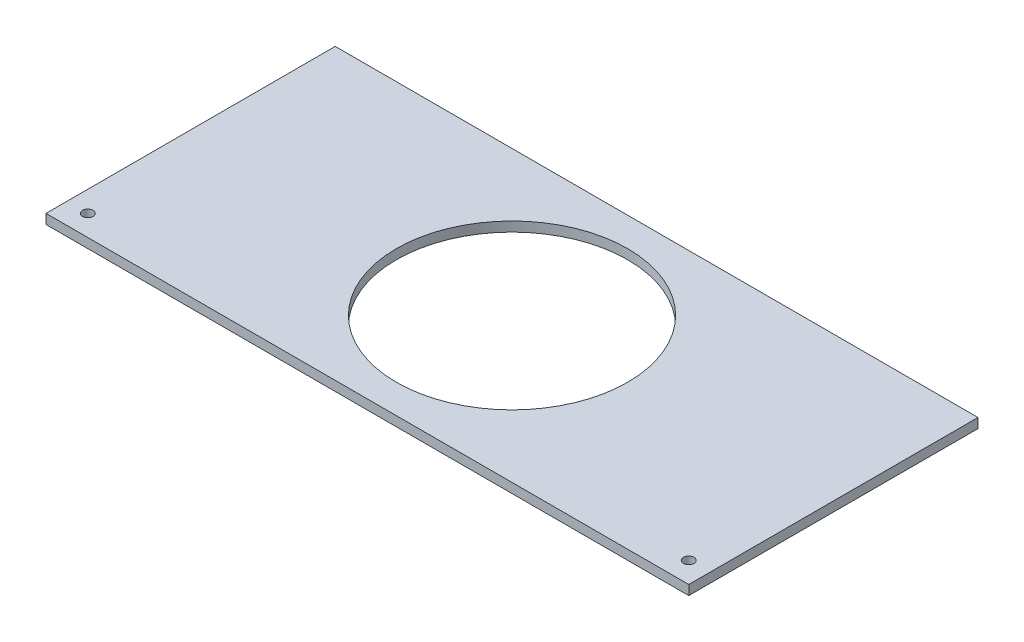
ISO-10303-21;
HEADER;
FILE_DESCRIPTION(('STEP AP214'),'2;1');
FILE_NAME('part.step','',(''),(''),'','','');
FILE_SCHEMA(('AUTOMOTIVE_DESIGN { 1 0 10303 214 1 1 1 1 }'));
ENDSEC;
DATA;
#1=APPLICATION_CONTEXT('core data for automotive mechanical design processes');
#2=APPLICATION_PROTOCOL_DEFINITION('international standard','automotive_design',2000,#1);
#3=PRODUCT_CONTEXT('',#1,'mechanical');
#4=PRODUCT('Part','Part','',(#3));
#5=PRODUCT_RELATED_PRODUCT_CATEGORY('part','',(#4));
#6=PRODUCT_DEFINITION_FORMATION('','',#4);
#7=PRODUCT_DEFINITION_CONTEXT('part definition',#1,'design');
#8=PRODUCT_DEFINITION('design','',#6,#7);
#9=PRODUCT_DEFINITION_SHAPE('','',#8);
#10=(LENGTH_UNIT() NAMED_UNIT(*) SI_UNIT(.MILLI.,.METRE.));
#11=(NAMED_UNIT(*) PLANE_ANGLE_UNIT() SI_UNIT($,.RADIAN.));
#12=(NAMED_UNIT(*) SI_UNIT($,.STERADIAN.) SOLID_ANGLE_UNIT());
#13=UNCERTAINTY_MEASURE_WITH_UNIT(LENGTH_MEASURE(1.E-05),#10,'distance_accuracy_value','');
#14=(GEOMETRIC_REPRESENTATION_CONTEXT(3) GLOBAL_UNCERTAINTY_ASSIGNED_CONTEXT((#13)) GLOBAL_UNIT_ASSIGNED_CONTEXT((#10,
#11,#12)) REPRESENTATION_CONTEXT('',''));
#15=CARTESIAN_POINT('',(0.,0.,0.));
#16=DIRECTION('',(0.,0.,1.));
#17=DIRECTION('',(1.,0.,0.));
#18=AXIS2_PLACEMENT_3D('',#15,#16,#17);
#19=CARTESIAN_POINT('',(0.,3.,0.));
#20=DIRECTION('',(0.,-1.,0.));
#21=DIRECTION('',(0.,0.,-1.));
#22=AXIS2_PLACEMENT_3D('',#19,#20,#21);
#23=PLANE('',#22);
#24=CARTESIAN_POINT('',(6.50000000000006,3.,-6.49999999999995));
#25=DIRECTION('',(0.,1.,0.));
#26=DIRECTION('',(0.,0.,1.));
#27=AXIS2_PLACEMENT_3D('',#24,#25,#26);
#28=CIRCLE('',#27,1.65);
#29=CARTESIAN_POINT('',(6.50000000000006,3.,-4.84999999999995));
#30=VERTEX_POINT('',#29);
#31=EDGE_CURVE('E114',#30,#30,#28,.T.);
#32=ORIENTED_EDGE('',*,*,#31,.F.);
#33=EDGE_LOOP('',(#32));
#34=FACE_BOUND('',#33,.T.);
#35=DIRECTION('',(0.,0.,1.));
#36=VECTOR('',#35,1.);
#37=CARTESIAN_POINT('',(0.,3.,0.));
#38=LINE('',#37,#36);
#39=CARTESIAN_POINT('',(0.,3.,-90.));
#40=VERTEX_POINT('',#39);
#41=CARTESIAN_POINT('',(0.,3.,0.));
#42=VERTEX_POINT('',#41);
#43=EDGE_CURVE('E84',#40,#42,#38,.T.);
#44=ORIENTED_EDGE('',*,*,#43,.T.);
#45=DIRECTION('',(1.,0.,0.));
#46=VECTOR('',#45,1.);
#47=CARTESIAN_POINT('',(0.,3.,0.));
#48=LINE('',#47,#46);
#49=CARTESIAN_POINT('',(200.,3.,0.));
#50=VERTEX_POINT('',#49);
#51=EDGE_CURVE('E79',#42,#50,#48,.T.);
#52=ORIENTED_EDGE('',*,*,#51,.T.);
#53=DIRECTION('',(0.,0.,-1.));
#54=VECTOR('',#53,1.);
#55=CARTESIAN_POINT('',(200.,3.,0.));
#56=LINE('',#55,#54);
#57=CARTESIAN_POINT('',(200.,3.,-90.));
#58=VERTEX_POINT('',#57);
#59=EDGE_CURVE('E82',#50,#58,#56,.T.);
#60=ORIENTED_EDGE('',*,*,#59,.T.);
#61=DIRECTION('',(-1.,0.,0.));
#62=VECTOR('',#61,1.);
#63=CARTESIAN_POINT('',(0.,3.,-90.));
#64=LINE('',#63,#62);
#65=EDGE_CURVE('E49',#58,#40,#64,.T.);
#66=ORIENTED_EDGE('',*,*,#65,.T.);
#67=EDGE_LOOP('',(#44,#52,#60,#66));
#68=FACE_BOUND('',#67,.T.);
#69=CARTESIAN_POINT('',(100.,3.,-45.));
#70=DIRECTION('',(0.,1.,0.));
#71=DIRECTION('',(0.,0.,1.));
#72=AXIS2_PLACEMENT_3D('',#69,#70,#71);
#73=CIRCLE('',#72,36.);
#74=CARTESIAN_POINT('',(100.,3.,-8.99999999999997));
#75=VERTEX_POINT('',#74);
#76=EDGE_CURVE('E99',#75,#75,#73,.T.);
#77=ORIENTED_EDGE('',*,*,#76,.F.);
#78=EDGE_LOOP('',(#77));
#79=FACE_BOUND('',#78,.T.);
#80=CARTESIAN_POINT('',(193.5,3.,-6.49999999999998));
#81=DIRECTION('',(0.,1.,0.));
#82=DIRECTION('',(0.,0.,1.));
#83=AXIS2_PLACEMENT_3D('',#80,#81,#82);
#84=CIRCLE('',#83,1.65000000000002);
#85=CARTESIAN_POINT('',(193.5,3.,-4.84999999999996));
#86=VERTEX_POINT('',#85);
#87=EDGE_CURVE('E120',#86,#86,#84,.T.);
#88=ORIENTED_EDGE('',*,*,#87,.F.);
#89=EDGE_LOOP('',(#88));
#90=FACE_BOUND('',#89,.T.);
#91=ADVANCED_FACE('F32',(#34,#68,#79,#90),#23,.F.);
#92=CARTESIAN_POINT('',(0.,0.,0.));
#93=DIRECTION('',(0.,-1.,0.));
#94=DIRECTION('',(0.,0.,-1.));
#95=AXIS2_PLACEMENT_3D('',#92,#93,#94);
#96=PLANE('',#95);
#97=CARTESIAN_POINT('',(6.50000000000006,0.,-6.49999999999995));
#98=DIRECTION('',(0.,1.,0.));
#99=DIRECTION('',(0.,0.,1.));
#100=AXIS2_PLACEMENT_3D('',#97,#98,#99);
#101=CIRCLE('',#100,1.65);
#102=CARTESIAN_POINT('',(6.50000000000006,0.,-4.84999999999995));
#103=VERTEX_POINT('',#102);
#104=EDGE_CURVE('E117',#103,#103,#101,.T.);
#105=ORIENTED_EDGE('',*,*,#104,.T.);
#106=EDGE_LOOP('',(#105));
#107=FACE_BOUND('',#106,.T.);
#108=DIRECTION('',(0.,0.,1.));
#109=VECTOR('',#108,1.);
#110=CARTESIAN_POINT('',(0.,0.,0.));
#111=LINE('',#110,#109);
#112=CARTESIAN_POINT('',(0.,0.,-90.));
#113=VERTEX_POINT('',#112);
#114=CARTESIAN_POINT('',(0.,0.,0.));
#115=VERTEX_POINT('',#114);
#116=EDGE_CURVE('E96',#113,#115,#111,.T.);
#117=ORIENTED_EDGE('',*,*,#116,.F.);
#118=DIRECTION('',(-1.,0.,0.));
#119=VECTOR('',#118,1.);
#120=CARTESIAN_POINT('',(0.,0.,-90.));
#121=LINE('',#120,#119);
#122=CARTESIAN_POINT('',(200.,0.,-90.));
#123=VERTEX_POINT('',#122);
#124=EDGE_CURVE('E72',#123,#113,#121,.T.);
#125=ORIENTED_EDGE('',*,*,#124,.F.);
#126=DIRECTION('',(0.,0.,-1.));
#127=VECTOR('',#126,1.);
#128=CARTESIAN_POINT('',(200.,0.,0.));
#129=LINE('',#128,#127);
#130=CARTESIAN_POINT('',(200.,0.,0.));
#131=VERTEX_POINT('',#130);
#132=EDGE_CURVE('E66',#131,#123,#129,.T.);
#133=ORIENTED_EDGE('',*,*,#132,.F.);
#134=DIRECTION('',(1.,0.,0.));
#135=VECTOR('',#134,1.);
#136=CARTESIAN_POINT('',(0.,0.,0.));
#137=LINE('',#136,#135);
#138=EDGE_CURVE('E88',#115,#131,#137,.T.);
#139=ORIENTED_EDGE('',*,*,#138,.F.);
#140=EDGE_LOOP('',(#117,#125,#133,#139));
#141=FACE_BOUND('',#140,.T.);
#142=CARTESIAN_POINT('',(100.,0.,-45.));
#143=DIRECTION('',(0.,1.,0.));
#144=DIRECTION('',(0.,0.,1.));
#145=AXIS2_PLACEMENT_3D('',#142,#143,#144);
#146=CIRCLE('',#145,36.);
#147=CARTESIAN_POINT('',(100.,0.,-8.99999999999997));
#148=VERTEX_POINT('',#147);
#149=EDGE_CURVE('E111',#148,#148,#146,.T.);
#150=ORIENTED_EDGE('',*,*,#149,.T.);
#151=EDGE_LOOP('',(#150));
#152=FACE_BOUND('',#151,.T.);
#153=CARTESIAN_POINT('',(193.5,0.,-6.49999999999998));
#154=DIRECTION('',(0.,1.,0.));
#155=DIRECTION('',(0.,0.,1.));
#156=AXIS2_PLACEMENT_3D('',#153,#154,#155);
#157=CIRCLE('',#156,1.65000000000002);
#158=CARTESIAN_POINT('',(193.5,0.,-4.84999999999996));
#159=VERTEX_POINT('',#158);
#160=EDGE_CURVE('E123',#159,#159,#157,.T.);
#161=ORIENTED_EDGE('',*,*,#160,.T.);
#162=EDGE_LOOP('',(#161));
#163=FACE_BOUND('',#162,.T.);
#164=ADVANCED_FACE('F107',(#107,#141,#152,#163),#96,.T.);
#165=CARTESIAN_POINT('',(0.,3.,0.));
#166=DIRECTION('',(1.,0.,0.));
#167=DIRECTION('',(0.,0.,-1.));
#168=AXIS2_PLACEMENT_3D('',#165,#166,#167);
#169=PLANE('',#168);
#170=ORIENTED_EDGE('',*,*,#116,.T.);
#171=DIRECTION('',(0.,-1.,0.));
#172=VECTOR('',#171,1.);
#173=CARTESIAN_POINT('',(0.,3.,0.));
#174=LINE('',#173,#172);
#175=EDGE_CURVE('E11',#42,#115,#174,.T.);
#176=ORIENTED_EDGE('',*,*,#175,.F.);
#177=ORIENTED_EDGE('',*,*,#43,.F.);
#178=DIRECTION('',(0.,-1.,0.));
#179=VECTOR('',#178,1.);
#180=CARTESIAN_POINT('',(0.,3.,-90.));
#181=LINE('',#180,#179);
#182=EDGE_CURVE('E92',#40,#113,#181,.T.);
#183=ORIENTED_EDGE('',*,*,#182,.T.);
#184=EDGE_LOOP('',(#170,#176,#177,#183));
#185=FACE_BOUND('',#184,.T.);
#186=ADVANCED_FACE('F34',(#185),#169,.F.);
#187=CARTESIAN_POINT('',(0.,3.,0.));
#188=DIRECTION('',(0.,0.,-1.));
#189=DIRECTION('',(-1.,0.,0.));
#190=AXIS2_PLACEMENT_3D('',#187,#188,#189);
#191=PLANE('',#190);
#192=ORIENTED_EDGE('',*,*,#138,.T.);
#193=DIRECTION('',(0.,-1.,0.));
#194=VECTOR('',#193,1.);
#195=CARTESIAN_POINT('',(200.,3.,0.));
#196=LINE('',#195,#194);
#197=EDGE_CURVE('E41',#50,#131,#196,.T.);
#198=ORIENTED_EDGE('',*,*,#197,.F.);
#199=ORIENTED_EDGE('',*,*,#51,.F.);
#200=ORIENTED_EDGE('',*,*,#175,.T.);
#201=EDGE_LOOP('',(#192,#198,#199,#200));
#202=FACE_BOUND('',#201,.T.);
#203=ADVANCED_FACE('F87',(#202),#191,.F.);
#204=CARTESIAN_POINT('',(200.,3.,0.));
#205=DIRECTION('',(-1.,0.,0.));
#206=DIRECTION('',(0.,0.,1.));
#207=AXIS2_PLACEMENT_3D('',#204,#205,#206);
#208=PLANE('',#207);
#209=ORIENTED_EDGE('',*,*,#132,.T.);
#210=DIRECTION('',(0.,-1.,0.));
#211=VECTOR('',#210,1.);
#212=CARTESIAN_POINT('',(200.,3.,-90.));
#213=LINE('',#212,#211);
#214=EDGE_CURVE('E89',#58,#123,#213,.T.);
#215=ORIENTED_EDGE('',*,*,#214,.F.);
#216=ORIENTED_EDGE('',*,*,#59,.F.);
#217=ORIENTED_EDGE('',*,*,#197,.T.);
#218=EDGE_LOOP('',(#209,#215,#216,#217));
#219=FACE_BOUND('',#218,.T.);
#220=ADVANCED_FACE('F90',(#219),#208,.F.);
#221=CARTESIAN_POINT('',(0.,3.,-90.));
#222=DIRECTION('',(0.,0.,1.));
#223=DIRECTION('',(1.,0.,0.));
#224=AXIS2_PLACEMENT_3D('',#221,#222,#223);
#225=PLANE('',#224);
#226=ORIENTED_EDGE('',*,*,#124,.T.);
#227=ORIENTED_EDGE('',*,*,#182,.F.);
#228=ORIENTED_EDGE('',*,*,#65,.F.);
#229=ORIENTED_EDGE('',*,*,#214,.T.);
#230=EDGE_LOOP('',(#226,#227,#228,#229));
#231=FACE_BOUND('',#230,.T.);
#232=ADVANCED_FACE('F104',(#231),#225,.F.);
#233=CARTESIAN_POINT('',(100.,3.,-45.));
#234=DIRECTION('',(0.,-1.,0.));
#235=DIRECTION('',(0.,0.,-1.));
#236=AXIS2_PLACEMENT_3D('',#233,#234,#235);
#237=CYLINDRICAL_SURFACE('',#236,36.);
#238=ORIENTED_EDGE('',*,*,#76,.T.);
#239=EDGE_LOOP('',(#238));
#240=FACE_BOUND('',#239,.T.);
#241=ORIENTED_EDGE('',*,*,#149,.F.);
#242=EDGE_LOOP('',(#241));
#243=FACE_BOUND('',#242,.T.);
#244=ADVANCED_FACE('F142',(#240,#243),#237,.F.);
#245=CARTESIAN_POINT('',(6.50000000000006,3.,-6.49999999999995));
#246=DIRECTION('',(0.,-1.,0.));
#247=DIRECTION('',(0.,0.,-1.));
#248=AXIS2_PLACEMENT_3D('',#245,#246,#247);
#249=CYLINDRICAL_SURFACE('',#248,1.65);
#250=ORIENTED_EDGE('',*,*,#31,.T.);
#251=EDGE_LOOP('',(#250));
#252=FACE_BOUND('',#251,.T.);
#253=ORIENTED_EDGE('',*,*,#104,.F.);
#254=EDGE_LOOP('',(#253));
#255=FACE_BOUND('',#254,.T.);
#256=ADVANCED_FACE('F188',(#252,#255),#249,.F.);
#257=CARTESIAN_POINT('',(193.5,3.,-6.49999999999998));
#258=DIRECTION('',(0.,-1.,0.));
#259=DIRECTION('',(0.,0.,-1.));
#260=AXIS2_PLACEMENT_3D('',#257,#258,#259);
#261=CYLINDRICAL_SURFACE('',#260,1.65000000000002);
#262=ORIENTED_EDGE('',*,*,#87,.T.);
#263=EDGE_LOOP('',(#262));
#264=FACE_BOUND('',#263,.T.);
#265=ORIENTED_EDGE('',*,*,#160,.F.);
#266=EDGE_LOOP('',(#265));
#267=FACE_BOUND('',#266,.T.);
#268=ADVANCED_FACE('F129',(#264,#267),#261,.F.);
#269=CLOSED_SHELL('',(#91,#164,#186,#203,#220,#232,#244,#256,#268));
#270=MANIFOLD_SOLID_BREP('B2',#269);
#271=ADVANCED_BREP_SHAPE_REPRESENTATION('',(#18,#270),#14);
#272=SHAPE_DEFINITION_REPRESENTATION(#9,#271);
ENDSEC;
END-ISO-10303-21;
